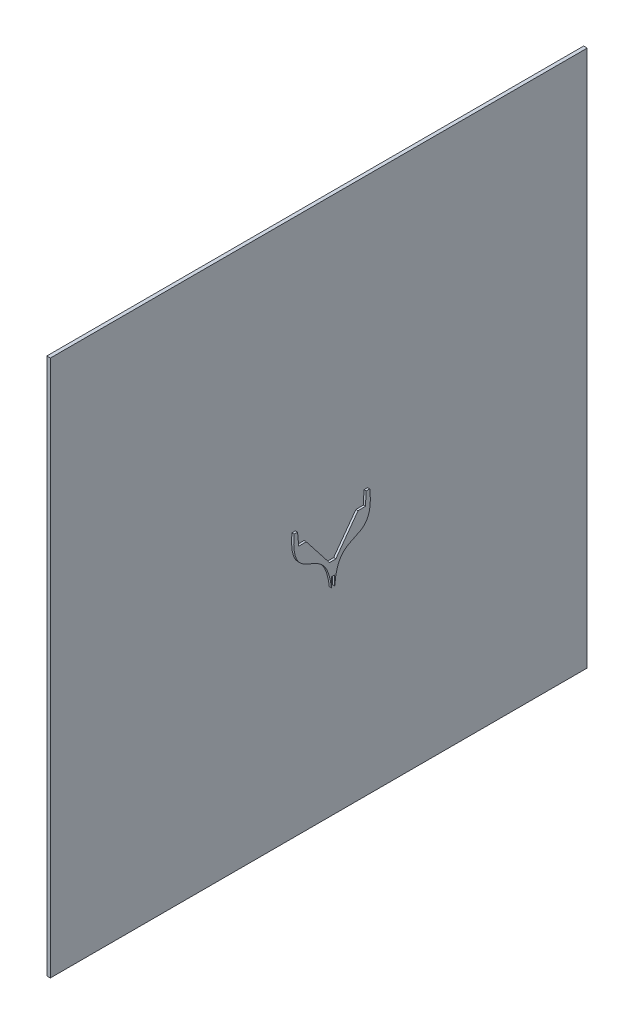
ISO-10303-21;
HEADER;
FILE_DESCRIPTION(('STEP AP214'),'2;1');
FILE_NAME('part.step','',(''),(''),'','','');
FILE_SCHEMA(('AUTOMOTIVE_DESIGN { 1 0 10303 214 1 1 1 1 }'));
ENDSEC;
DATA;
#1=APPLICATION_CONTEXT('core data for automotive mechanical design processes');
#2=APPLICATION_PROTOCOL_DEFINITION('international standard','automotive_design',2000,#1);
#3=PRODUCT_CONTEXT('',#1,'mechanical');
#4=PRODUCT('Part','Part','',(#3));
#5=PRODUCT_RELATED_PRODUCT_CATEGORY('part','',(#4));
#6=PRODUCT_DEFINITION_FORMATION('','',#4);
#7=PRODUCT_DEFINITION_CONTEXT('part definition',#1,'design');
#8=PRODUCT_DEFINITION('design','',#6,#7);
#9=PRODUCT_DEFINITION_SHAPE('','',#8);
#10=(LENGTH_UNIT() NAMED_UNIT(*) SI_UNIT(.MILLI.,.METRE.));
#11=(NAMED_UNIT(*) PLANE_ANGLE_UNIT() SI_UNIT($,.RADIAN.));
#12=(NAMED_UNIT(*) SI_UNIT($,.STERADIAN.) SOLID_ANGLE_UNIT());
#13=UNCERTAINTY_MEASURE_WITH_UNIT(LENGTH_MEASURE(1.E-05),#10,'distance_accuracy_value','');
#14=(GEOMETRIC_REPRESENTATION_CONTEXT(3) GLOBAL_UNCERTAINTY_ASSIGNED_CONTEXT((#13)) GLOBAL_UNIT_ASSIGNED_CONTEXT((#10,
#11,#12)) REPRESENTATION_CONTEXT('',''));
#15=CARTESIAN_POINT('',(0.,0.,0.));
#16=DIRECTION('',(0.,0.,1.));
#17=DIRECTION('',(1.,0.,0.));
#18=AXIS2_PLACEMENT_3D('',#15,#16,#17);
#19=CARTESIAN_POINT('',(6.,370.822129591888,112.598828297359));
#20=CARTESIAN_POINT('',(6.,182.874693997176,126.922352921726));
#21=CARTESIAN_POINT('',(6.,385.564297762641,-42.5084959713896));
#22=CARTESIAN_POINT('',(6.,144.574203419103,18.4897994914163));
#23=CARTESIAN_POINT('',(6.,0.,0.));
#24=B_SPLINE_CURVE_WITH_KNOTS('',4,(#19,#20,#21,#22,#23),.UNSPECIFIED.,.F.,.F.,(5,5),(0.,1.),.UNSPECIFIED.);
#25=DIRECTION('',(-1.,0.,0.));
#26=VECTOR('',#25,1.);
#27=SURFACE_OF_LINEAR_EXTRUSION('',#24,#26);
#28=CARTESIAN_POINT('',(0.,370.822129591888,112.598828297359));
#29=CARTESIAN_POINT('',(0.,182.874693997176,126.922352921726));
#30=CARTESIAN_POINT('',(0.,385.564297762641,-42.5084959713896));
#31=CARTESIAN_POINT('',(0.,144.574203419103,18.4897994914163));
#32=CARTESIAN_POINT('',(0.,0.,0.));
#33=B_SPLINE_CURVE_WITH_KNOTS('',4,(#28,#29,#30,#31,#32),.UNSPECIFIED.,.F.,.F.,(5,5),(0.,1.),.UNSPECIFIED.);
#34=CARTESIAN_POINT('',(0.,370.822129591888,112.598828297359));
#35=VERTEX_POINT('',#34);
#36=CARTESIAN_POINT('',(0.,188.386674921609,7.91417243718743));
#37=VERTEX_POINT('',#36);
#38=EDGE_CURVE('E168',#35,#37,#33,.T.);
#39=ORIENTED_EDGE('',*,*,#38,.T.);
#40=DIRECTION('',(1.,0.,0.));
#41=VECTOR('',#40,1.);
#42=CARTESIAN_POINT('',(0.,188.386674921609,7.91417243718743));
#43=LINE('',#42,#41);
#44=CARTESIAN_POINT('',(6.,188.386674921609,7.91417243718743));
#45=VERTEX_POINT('',#44);
#46=EDGE_CURVE('E174',#37,#45,#43,.T.);
#47=ORIENTED_EDGE('',*,*,#46,.T.);
#48=CARTESIAN_POINT('',(6.,370.822129591888,112.598828297359));
#49=VERTEX_POINT('',#48);
#50=EDGE_CURVE('E201',#49,#45,#24,.T.);
#51=ORIENTED_EDGE('',*,*,#50,.F.);
#52=DIRECTION('',(-1.,0.,0.));
#53=VECTOR('',#52,1.);
#54=CARTESIAN_POINT('',(6.,370.822129591888,112.598828297359));
#55=LINE('',#54,#53);
#56=EDGE_CURVE('E164',#49,#35,#55,.T.);
#57=ORIENTED_EDGE('',*,*,#56,.T.);
#58=EDGE_LOOP('',(#39,#47,#51,#57));
#59=FACE_BOUND('',#58,.T.);
#60=ADVANCED_FACE('F45',(#59),#27,.F.);
#61=CARTESIAN_POINT('',(6.,0.,0.));
#62=CARTESIAN_POINT('',(6.,145.149025233633,-13.2413539046072));
#63=CARTESIAN_POINT('',(6.,383.771712272267,56.4453080296346));
#64=CARTESIAN_POINT('',(6.,187.351690565542,-120.215562295326));
#65=CARTESIAN_POINT('',(6.,374.657028519018,-99.0941921118525));
#66=B_SPLINE_CURVE_WITH_KNOTS('',4,(#61,#62,#63,#64,#65),.UNSPECIFIED.,.F.,.F.,(5,5),(0.,1.),.UNSPECIFIED.);
#67=DIRECTION('',(-1.,0.,0.));
#68=VECTOR('',#67,1.);
#69=SURFACE_OF_LINEAR_EXTRUSION('',#66,#68);
#70=CARTESIAN_POINT('',(6.,188.549713316911,-1.08582756281257));
#71=VERTEX_POINT('',#70);
#72=CARTESIAN_POINT('',(6.,374.657028519018,-99.0941921118525));
#73=VERTEX_POINT('',#72);
#74=EDGE_CURVE('E116',#71,#73,#66,.T.);
#75=ORIENTED_EDGE('',*,*,#74,.F.);
#76=DIRECTION('',(1.,0.,0.));
#77=VECTOR('',#76,1.);
#78=CARTESIAN_POINT('',(0.,188.549713316911,-1.08582756281257));
#79=LINE('',#78,#77);
#80=CARTESIAN_POINT('',(0.,188.549713316911,-1.08582756281257));
#81=VERTEX_POINT('',#80);
#82=EDGE_CURVE('E321',#81,#71,#79,.T.);
#83=ORIENTED_EDGE('',*,*,#82,.F.);
#84=CARTESIAN_POINT('',(0.,0.,0.));
#85=CARTESIAN_POINT('',(0.,145.149025233633,-13.2413539046072));
#86=CARTESIAN_POINT('',(0.,383.771712272267,56.4453080296346));
#87=CARTESIAN_POINT('',(0.,187.351690565542,-120.215562295326));
#88=CARTESIAN_POINT('',(0.,374.657028519018,-99.0941921118525));
#89=B_SPLINE_CURVE_WITH_KNOTS('',4,(#84,#85,#86,#87,#88),.UNSPECIFIED.,.F.,.F.,(5,5),(0.,1.),.UNSPECIFIED.);
#90=CARTESIAN_POINT('',(0.,374.657028519018,-99.0941921118525));
#91=VERTEX_POINT('',#90);
#92=EDGE_CURVE('E173',#81,#91,#89,.T.);
#93=ORIENTED_EDGE('',*,*,#92,.T.);
#94=DIRECTION('',(-1.,0.,0.));
#95=VECTOR('',#94,1.);
#96=CARTESIAN_POINT('',(6.,374.657028519018,-99.0941921118525));
#97=LINE('',#96,#95);
#98=EDGE_CURVE('E13',#73,#91,#97,.T.);
#99=ORIENTED_EDGE('',*,*,#98,.F.);
#100=EDGE_LOOP('',(#75,#83,#93,#99));
#101=FACE_BOUND('',#100,.T.);
#102=ADVANCED_FACE('F261',(#101),#69,.F.);
#103=CARTESIAN_POINT('',(6.,374.657028519018,-99.0941921118525));
#104=DIRECTION('',(0.,-0.999835956927465,-0.0181124055536444));
#105=DIRECTION('',(0.,0.0181124055536444,-0.999835956927465));
#106=AXIS2_PLACEMENT_3D('',#103,#104,#105);
#107=PLANE('',#106);
#108=DIRECTION('',(0.,-0.0181124055536444,0.999835956927465));
#109=VECTOR('',#108,1.);
#110=CARTESIAN_POINT('',(0.,374.657028519018,-99.0941921118525));
#111=LINE('',#110,#109);
#112=CARTESIAN_POINT('',(0.,374.47587474646,-89.0941921118525));
#113=VERTEX_POINT('',#112);
#114=EDGE_CURVE('E181',#91,#113,#111,.T.);
#115=ORIENTED_EDGE('',*,*,#114,.T.);
#116=DIRECTION('',(-1.,0.,0.));
#117=VECTOR('',#116,1.);
#118=CARTESIAN_POINT('',(6.,374.47587474646,-89.0941921118525));
#119=LINE('',#118,#117);
#120=CARTESIAN_POINT('',(6.,374.47587474646,-89.0941921118525));
#121=VERTEX_POINT('',#120);
#122=EDGE_CURVE('E53',#121,#113,#119,.T.);
#123=ORIENTED_EDGE('',*,*,#122,.F.);
#124=DIRECTION('',(0.,-0.0181124055536444,0.999835956927465));
#125=VECTOR('',#124,1.);
#126=CARTESIAN_POINT('',(6.,374.657028519018,-99.0941921118525));
#127=LINE('',#126,#125);
#128=EDGE_CURVE('E249',#73,#121,#127,.T.);
#129=ORIENTED_EDGE('',*,*,#128,.F.);
#130=ORIENTED_EDGE('',*,*,#98,.T.);
#131=EDGE_LOOP('',(#115,#123,#129,#130));
#132=FACE_BOUND('',#131,.T.);
#133=ADVANCED_FACE('F264',(#132),#107,.F.);
#134=CARTESIAN_POINT('',(6.,374.47587474646,-89.0941921118525));
#135=DIRECTION('',(0.,-0.0547192958963739,-0.998501776992212));
#136=DIRECTION('',(0.,0.998501776992212,-0.0547192958963739));
#137=AXIS2_PLACEMENT_3D('',#134,#135,#136);
#138=PLANE('',#137);
#139=DIRECTION('',(0.,-0.998501776992212,0.0547192958963739));
#140=VECTOR('',#139,1.);
#141=CARTESIAN_POINT('',(0.,374.47587474646,-89.0941921118525));
#142=LINE('',#141,#140);
#143=CARTESIAN_POINT('',(0.,338.422661800034,-87.1184255456946));
#144=VERTEX_POINT('',#143);
#145=EDGE_CURVE('E186',#113,#144,#142,.T.);
#146=ORIENTED_EDGE('',*,*,#145,.T.);
#147=DIRECTION('',(-1.,0.,0.));
#148=VECTOR('',#147,1.);
#149=CARTESIAN_POINT('',(6.,338.422661800034,-87.1184255456946));
#150=LINE('',#149,#148);
#151=CARTESIAN_POINT('',(6.,338.422661800034,-87.1184255456946));
#152=VERTEX_POINT('',#151);
#153=EDGE_CURVE('E214',#152,#144,#150,.T.);
#154=ORIENTED_EDGE('',*,*,#153,.F.);
#155=DIRECTION('',(0.,-0.998501776992212,0.0547192958963739));
#156=VECTOR('',#155,1.);
#157=CARTESIAN_POINT('',(6.,374.47587474646,-89.0941921118525));
#158=LINE('',#157,#156);
#159=EDGE_CURVE('E223',#121,#152,#158,.T.);
#160=ORIENTED_EDGE('',*,*,#159,.F.);
#161=ORIENTED_EDGE('',*,*,#122,.T.);
#162=EDGE_LOOP('',(#146,#154,#160,#161));
#163=FACE_BOUND('',#162,.T.);
#164=ADVANCED_FACE('F221',(#163),#138,.F.);
#165=CARTESIAN_POINT('',(6.,338.422661800034,-87.1184255456946));
#166=DIRECTION('',(0.,-0.999835956927465,-0.0181124055536402));
#167=DIRECTION('',(0.,0.0181124055536402,-0.999835956927466));
#168=AXIS2_PLACEMENT_3D('',#165,#166,#167);
#169=PLANE('',#168);
#170=DIRECTION('',(0.,-0.0181124055536402,0.999835956927465));
#171=VECTOR('',#170,1.);
#172=CARTESIAN_POINT('',(0.,338.422661800034,-87.1184255456946));
#173=LINE('',#172,#171);
#174=CARTESIAN_POINT('',(0.,338.04602384503,-66.3273622580532));
#175=VERTEX_POINT('',#174);
#176=EDGE_CURVE('E188',#144,#175,#173,.T.);
#177=ORIENTED_EDGE('',*,*,#176,.T.);
#178=DIRECTION('',(-1.,0.,0.));
#179=VECTOR('',#178,1.);
#180=CARTESIAN_POINT('',(6.,338.04602384503,-66.3273622580532));
#181=LINE('',#180,#179);
#182=CARTESIAN_POINT('',(6.,338.04602384503,-66.3273622580532));
#183=VERTEX_POINT('',#182);
#184=EDGE_CURVE('E211',#183,#175,#181,.T.);
#185=ORIENTED_EDGE('',*,*,#184,.F.);
#186=DIRECTION('',(0.,-0.0181124055536402,0.999835956927465));
#187=VECTOR('',#186,1.);
#188=CARTESIAN_POINT('',(6.,338.422661800034,-87.1184255456946));
#189=LINE('',#188,#187);
#190=EDGE_CURVE('E243',#152,#183,#189,.T.);
#191=ORIENTED_EDGE('',*,*,#190,.F.);
#192=ORIENTED_EDGE('',*,*,#153,.T.);
#193=EDGE_LOOP('',(#177,#185,#191,#192));
#194=FACE_BOUND('',#193,.T.);
#195=ADVANCED_FACE('F234',(#194),#169,.F.);
#196=CARTESIAN_POINT('',(6.,338.04602384503,-66.3273622580532));
#197=DIRECTION('',(0.,-0.588261522683057,-0.808670749397189));
#198=DIRECTION('',(0.,0.808670749397189,-0.588261522683057));
#199=AXIS2_PLACEMENT_3D('',#196,#197,#198);
#200=PLANE('',#199);
#201=DIRECTION('',(0.,-0.808670749397189,0.588261522683057));
#202=VECTOR('',#201,1.);
#203=CARTESIAN_POINT('',(0.,338.04602384503,-66.3273622580532));
#204=LINE('',#203,#202);
#205=CARTESIAN_POINT('',(0.,252.698090033362,-4.24164252683945));
#206=VERTEX_POINT('',#205);
#207=EDGE_CURVE('E190',#175,#206,#204,.T.);
#208=ORIENTED_EDGE('',*,*,#207,.T.);
#209=DIRECTION('',(-1.,0.,0.));
#210=VECTOR('',#209,1.);
#211=CARTESIAN_POINT('',(6.,252.698090033362,-4.24164252683945));
#212=LINE('',#211,#210);
#213=CARTESIAN_POINT('',(6.,252.698090033362,-4.24164252683945));
#214=VERTEX_POINT('',#213);
#215=EDGE_CURVE('E208',#214,#206,#212,.T.);
#216=ORIENTED_EDGE('',*,*,#215,.F.);
#217=DIRECTION('',(0.,-0.808670749397189,0.588261522683057));
#218=VECTOR('',#217,1.);
#219=CARTESIAN_POINT('',(6.,338.04602384503,-66.3273622580532));
#220=LINE('',#219,#218);
#221=EDGE_CURVE('E240',#183,#214,#220,.T.);
#222=ORIENTED_EDGE('',*,*,#221,.F.);
#223=ORIENTED_EDGE('',*,*,#184,.T.);
#224=EDGE_LOOP('',(#208,#216,#222,#223));
#225=FACE_BOUND('',#224,.T.);
#226=ADVANCED_FACE('F238',(#225),#200,.F.);
#227=CARTESIAN_POINT('',(6.,252.378662655529,13.3912984449269));
#228=DIRECTION('',(0.,-0.999835956927465,-0.0181124055536442));
#229=DIRECTION('',(0.,0.0181124055536442,-0.999835956927465));
#230=AXIS2_PLACEMENT_3D('',#227,#228,#229);
#231=PLANE('',#230);
#232=DIRECTION('',(0.,-0.0181124055536442,0.999835956927465));
#233=VECTOR('',#232,1.);
#234=CARTESIAN_POINT('',(0.,252.378662655529,13.3912984449269));
#235=LINE('',#234,#233);
#236=CARTESIAN_POINT('',(0.,252.378662655529,13.3912984449269));
#237=VERTEX_POINT('',#236);
#238=EDGE_CURVE('E193',#206,#237,#235,.T.);
#239=ORIENTED_EDGE('',*,*,#238,.T.);
#240=DIRECTION('',(-1.,0.,0.));
#241=VECTOR('',#240,1.);
#242=CARTESIAN_POINT('',(6.,252.378662655529,13.3912984449269));
#243=LINE('',#242,#241);
#244=CARTESIAN_POINT('',(6.,252.378662655529,13.3912984449269));
#245=VERTEX_POINT('',#244);
#246=EDGE_CURVE('E205',#245,#237,#243,.T.);
#247=ORIENTED_EDGE('',*,*,#246,.F.);
#248=DIRECTION('',(0.,-0.0181124055536442,0.999835956927465));
#249=VECTOR('',#248,1.);
#250=CARTESIAN_POINT('',(6.,252.698090033362,-4.24164252683945));
#251=LINE('',#250,#249);
#252=EDGE_CURVE('E242',#214,#245,#251,.T.);
#253=ORIENTED_EDGE('',*,*,#252,.F.);
#254=ORIENTED_EDGE('',*,*,#215,.T.);
#255=EDGE_LOOP('',(#239,#247,#253,#254));
#256=FACE_BOUND('',#255,.T.);
#257=ADVANCED_FACE('F274',(#256),#231,.F.);
#258=CARTESIAN_POINT('',(6.,335.421923581735,78.5274881953701));
#259=DIRECTION('',(0.,-0.617164693109037,0.786833998744098));
#260=DIRECTION('',(0.,-0.786833998744098,-0.617164693109037));
#261=AXIS2_PLACEMENT_3D('',#258,#259,#260);
#262=PLANE('',#261);
#263=DIRECTION('',(0.,0.786833998744098,0.617164693109037));
#264=VECTOR('',#263,1.);
#265=CARTESIAN_POINT('',(0.,335.421923581735,78.5274881953701));
#266=LINE('',#265,#264);
#267=CARTESIAN_POINT('',(0.,335.421923581735,78.5274881953701));
#268=VERTEX_POINT('',#267);
#269=EDGE_CURVE('E195',#237,#268,#266,.T.);
#270=ORIENTED_EDGE('',*,*,#269,.T.);
#271=DIRECTION('',(-1.,0.,0.));
#272=VECTOR('',#271,1.);
#273=CARTESIAN_POINT('',(6.,335.421923581735,78.5274881953701));
#274=LINE('',#273,#272);
#275=CARTESIAN_POINT('',(6.,335.421923581735,78.5274881953701));
#276=VERTEX_POINT('',#275);
#277=EDGE_CURVE('E159',#276,#268,#274,.T.);
#278=ORIENTED_EDGE('',*,*,#277,.F.);
#279=DIRECTION('',(0.,0.786833998744098,0.617164693109037));
#280=VECTOR('',#279,1.);
#281=CARTESIAN_POINT('',(6.,335.421923581735,78.5274881953701));
#282=LINE('',#281,#280);
#283=EDGE_CURVE('E147',#245,#276,#282,.T.);
#284=ORIENTED_EDGE('',*,*,#283,.F.);
#285=ORIENTED_EDGE('',*,*,#246,.T.);
#286=EDGE_LOOP('',(#270,#278,#284,#285));
#287=FACE_BOUND('',#286,.T.);
#288=ADVANCED_FACE('F277',(#287),#262,.F.);
#289=CARTESIAN_POINT('',(6.,335.04528562673,99.3185514830115));
#290=DIRECTION('',(0.,-0.999835956927465,-0.0181124055536429));
#291=DIRECTION('',(0.,0.0181124055536429,-0.999835956927466));
#292=AXIS2_PLACEMENT_3D('',#289,#290,#291);
#293=PLANE('',#292);
#294=DIRECTION('',(0.,-0.0181124055536429,0.999835956927465));
#295=VECTOR('',#294,1.);
#296=CARTESIAN_POINT('',(0.,335.04528562673,99.3185514830115));
#297=LINE('',#296,#295);
#298=CARTESIAN_POINT('',(0.,335.04528562673,99.3185514830115));
#299=VERTEX_POINT('',#298);
#300=EDGE_CURVE('E156',#268,#299,#297,.T.);
#301=ORIENTED_EDGE('',*,*,#300,.T.);
#302=DIRECTION('',(-1.,0.,0.));
#303=VECTOR('',#302,1.);
#304=CARTESIAN_POINT('',(6.,335.04528562673,99.3185514830115));
#305=LINE('',#304,#303);
#306=CARTESIAN_POINT('',(6.,335.04528562673,99.3185514830115));
#307=VERTEX_POINT('',#306);
#308=EDGE_CURVE('E153',#307,#299,#305,.T.);
#309=ORIENTED_EDGE('',*,*,#308,.F.);
#310=DIRECTION('',(0.,-0.0181124055536429,0.999835956927465));
#311=VECTOR('',#310,1.);
#312=CARTESIAN_POINT('',(6.,335.04528562673,99.3185514830115));
#313=LINE('',#312,#311);
#314=EDGE_CURVE('E139',#276,#307,#313,.T.);
#315=ORIENTED_EDGE('',*,*,#314,.F.);
#316=ORIENTED_EDGE('',*,*,#277,.T.);
#317=EDGE_LOOP('',(#301,#309,#315,#316));
#318=FACE_BOUND('',#317,.T.);
#319=ADVANCED_FACE('F154',(#318),#293,.F.);
#320=CARTESIAN_POINT('',(6.,371.003283364446,102.598828297359));
#321=DIRECTION('',(0.,-0.0908479982912777,0.995864770541898));
#322=DIRECTION('',(0.,-0.995864770541899,-0.0908479982912777));
#323=AXIS2_PLACEMENT_3D('',#320,#321,#322);
#324=PLANE('',#323);
#325=DIRECTION('',(0.,0.995864770541898,0.0908479982912777));
#326=VECTOR('',#325,1.);
#327=CARTESIAN_POINT('',(0.,371.003283364446,102.598828297359));
#328=LINE('',#327,#326);
#329=CARTESIAN_POINT('',(0.,371.003283364446,102.598828297359));
#330=VERTEX_POINT('',#329);
#331=EDGE_CURVE('E198',#299,#330,#328,.T.);
#332=ORIENTED_EDGE('',*,*,#331,.T.);
#333=DIRECTION('',(-1.,0.,0.));
#334=VECTOR('',#333,1.);
#335=CARTESIAN_POINT('',(6.,371.003283364446,102.598828297359));
#336=LINE('',#335,#334);
#337=CARTESIAN_POINT('',(6.,371.003283364446,102.598828297359));
#338=VERTEX_POINT('',#337);
#339=EDGE_CURVE('E160',#338,#330,#336,.T.);
#340=ORIENTED_EDGE('',*,*,#339,.F.);
#341=DIRECTION('',(0.,0.995864770541898,0.0908479982912777));
#342=VECTOR('',#341,1.);
#343=CARTESIAN_POINT('',(6.,371.003283364446,102.598828297359));
#344=LINE('',#343,#342);
#345=EDGE_CURVE('E144',#307,#338,#344,.T.);
#346=ORIENTED_EDGE('',*,*,#345,.F.);
#347=ORIENTED_EDGE('',*,*,#308,.T.);
#348=EDGE_LOOP('',(#332,#340,#346,#347));
#349=FACE_BOUND('',#348,.T.);
#350=ADVANCED_FACE('F162',(#349),#324,.F.);
#351=CARTESIAN_POINT('',(6.,370.822129591888,112.598828297359));
#352=DIRECTION('',(0.,-0.999835956927465,-0.0181124055536442));
#353=DIRECTION('',(0.,0.0181124055536442,-0.999835956927465));
#354=AXIS2_PLACEMENT_3D('',#351,#352,#353);
#355=PLANE('',#354);
#356=DIRECTION('',(0.,-0.0181124055536442,0.999835956927465));
#357=VECTOR('',#356,1.);
#358=CARTESIAN_POINT('',(0.,370.822129591888,112.598828297359));
#359=LINE('',#358,#357);
#360=EDGE_CURVE('E108',#330,#35,#359,.T.);
#361=ORIENTED_EDGE('',*,*,#360,.T.);
#362=ORIENTED_EDGE('',*,*,#56,.F.);
#363=DIRECTION('',(0.,-0.0181124055536442,0.999835956927465));
#364=VECTOR('',#363,1.);
#365=CARTESIAN_POINT('',(6.,370.822129591888,112.598828297359));
#366=LINE('',#365,#364);
#367=EDGE_CURVE('E69',#338,#49,#366,.T.);
#368=ORIENTED_EDGE('',*,*,#367,.F.);
#369=ORIENTED_EDGE('',*,*,#339,.T.);
#370=EDGE_LOOP('',(#361,#362,#368,#369));
#371=FACE_BOUND('',#370,.T.);
#372=ADVANCED_FACE('F286',(#371),#355,.F.);
#373=CARTESIAN_POINT('',(6.,249.625219114553,27.4497788825994));
#374=DIRECTION('',(1.,0.,0.));
#375=DIRECTION('',(0.,0.,-1.));
#376=AXIS2_PLACEMENT_3D('',#373,#374,#375);
#377=PLANE('',#376);
#378=DIRECTION('',(0.,-0.999835956927465,-0.018112405553643));
#379=VECTOR('',#378,1.);
#380=CARTESIAN_POINT('',(6.,188.386674921609,7.91417243718743));
#381=LINE('',#380,#379);
#382=CARTESIAN_POINT('',(6.,215.386674921609,8.40328762309371));
#383=VERTEX_POINT('',#382);
#384=EDGE_CURVE('E335',#383,#45,#381,.T.);
#385=ORIENTED_EDGE('',*,*,#384,.F.);
#386=DIRECTION('',(0.,-0.0181124055536438,0.999835956927465));
#387=VECTOR('',#386,1.);
#388=CARTESIAN_POINT('',(6.,215.386674921609,8.40328762309371));
#389=LINE('',#388,#387);
#390=CARTESIAN_POINT('',(6.,215.549713316911,-0.596712376906292));
#391=VERTEX_POINT('',#390);
#392=EDGE_CURVE('E332',#391,#383,#389,.T.);
#393=ORIENTED_EDGE('',*,*,#392,.F.);
#394=DIRECTION('',(0.,0.999835956927465,0.0181124055536428));
#395=VECTOR('',#394,1.);
#396=CARTESIAN_POINT('',(6.,215.549713316911,-0.596712376906292));
#397=LINE('',#396,#395);
#398=EDGE_CURVE('E329',#71,#391,#397,.T.);
#399=ORIENTED_EDGE('',*,*,#398,.F.);
#400=ORIENTED_EDGE('',*,*,#74,.T.);
#401=ORIENTED_EDGE('',*,*,#128,.T.);
#402=ORIENTED_EDGE('',*,*,#159,.T.);
#403=ORIENTED_EDGE('',*,*,#190,.T.);
#404=ORIENTED_EDGE('',*,*,#221,.T.);
#405=ORIENTED_EDGE('',*,*,#252,.T.);
#406=ORIENTED_EDGE('',*,*,#283,.T.);
#407=ORIENTED_EDGE('',*,*,#314,.T.);
#408=ORIENTED_EDGE('',*,*,#345,.T.);
#409=ORIENTED_EDGE('',*,*,#367,.T.);
#410=ORIENTED_EDGE('',*,*,#50,.T.);
#411=EDGE_LOOP('',(#385,#393,#399,#400,#401,#402,#403,#404,#405,#406,#407,#408,#409,#410));
#412=FACE_BOUND('',#411,.T.);
#413=ADVANCED_FACE('F142',(#412),#377,.T.);
#414=CARTESIAN_POINT('',(0.,249.625219114553,27.4497788825994));
#415=DIRECTION('',(1.,0.,0.));
#416=DIRECTION('',(0.,0.,-1.));
#417=AXIS2_PLACEMENT_3D('',#414,#415,#416);
#418=PLANE('',#417);
#419=DIRECTION('',(0.,-0.0181124055536438,0.999835956927465));
#420=VECTOR('',#419,1.);
#421=CARTESIAN_POINT('',(0.,215.386674921609,8.40328762309371));
#422=LINE('',#421,#420);
#423=CARTESIAN_POINT('',(0.,215.549713316911,-0.59671237690629));
#424=VERTEX_POINT('',#423);
#425=CARTESIAN_POINT('',(0.,215.386674921609,8.40328762309371));
#426=VERTEX_POINT('',#425);
#427=EDGE_CURVE('E60',#424,#426,#422,.T.);
#428=ORIENTED_EDGE('',*,*,#427,.T.);
#429=DIRECTION('',(0.,-0.999835956927465,-0.018112405553643));
#430=VECTOR('',#429,1.);
#431=CARTESIAN_POINT('',(0.,188.386674921609,7.91417243718743));
#432=LINE('',#431,#430);
#433=EDGE_CURVE('E318',#426,#37,#432,.T.);
#434=ORIENTED_EDGE('',*,*,#433,.T.);
#435=ORIENTED_EDGE('',*,*,#38,.F.);
#436=ORIENTED_EDGE('',*,*,#360,.F.);
#437=ORIENTED_EDGE('',*,*,#331,.F.);
#438=ORIENTED_EDGE('',*,*,#300,.F.);
#439=ORIENTED_EDGE('',*,*,#269,.F.);
#440=ORIENTED_EDGE('',*,*,#238,.F.);
#441=ORIENTED_EDGE('',*,*,#207,.F.);
#442=ORIENTED_EDGE('',*,*,#176,.F.);
#443=ORIENTED_EDGE('',*,*,#145,.F.);
#444=ORIENTED_EDGE('',*,*,#114,.F.);
#445=ORIENTED_EDGE('',*,*,#92,.F.);
#446=DIRECTION('',(0.,0.999835956927465,0.0181124055536428));
#447=VECTOR('',#446,1.);
#448=CARTESIAN_POINT('',(0.,215.549713316911,-0.596712376906292));
#449=LINE('',#448,#447);
#450=EDGE_CURVE('E325',#81,#424,#449,.T.);
#451=ORIENTED_EDGE('',*,*,#450,.T.);
#452=EDGE_LOOP('',(#428,#434,#435,#436,#437,#438,#439,#440,#441,#442,#443,#444,#445,#451));
#453=FACE_BOUND('',#452,.T.);
#454=ADVANCED_FACE('F229',(#453),#418,.F.);
#455=CARTESIAN_POINT('',(0.,188.386674921609,7.91417243718743));
#456=DIRECTION('',(0.,-0.018112405553643,0.999835956927465));
#457=DIRECTION('',(0.,-0.999835956927466,-0.018112405553643));
#458=AXIS2_PLACEMENT_3D('',#455,#456,#457);
#459=PLANE('',#458);
#460=ORIENTED_EDGE('',*,*,#384,.T.);
#461=ORIENTED_EDGE('',*,*,#46,.F.);
#462=ORIENTED_EDGE('',*,*,#433,.F.);
#463=DIRECTION('',(1.,0.,0.));
#464=VECTOR('',#463,1.);
#465=CARTESIAN_POINT('',(0.,215.386674921609,8.40328762309371));
#466=LINE('',#465,#464);
#467=EDGE_CURVE('E338',#426,#383,#466,.T.);
#468=ORIENTED_EDGE('',*,*,#467,.T.);
#469=EDGE_LOOP('',(#460,#461,#462,#468));
#470=FACE_BOUND('',#469,.T.);
#471=ADVANCED_FACE('F291',(#470),#459,.F.);
#472=CARTESIAN_POINT('',(0.,215.386674921609,8.40328762309371));
#473=DIRECTION('',(0.,0.999835956927465,0.0181124055536438));
#474=DIRECTION('',(0.,-0.0181124055536438,0.999835956927466));
#475=AXIS2_PLACEMENT_3D('',#472,#473,#474);
#476=PLANE('',#475);
#477=ORIENTED_EDGE('',*,*,#392,.T.);
#478=ORIENTED_EDGE('',*,*,#467,.F.);
#479=ORIENTED_EDGE('',*,*,#427,.F.);
#480=DIRECTION('',(1.,0.,0.));
#481=VECTOR('',#480,1.);
#482=CARTESIAN_POINT('',(0.,215.549713316911,-0.596712376906292));
#483=LINE('',#482,#481);
#484=EDGE_CURVE('E324',#424,#391,#483,.T.);
#485=ORIENTED_EDGE('',*,*,#484,.T.);
#486=EDGE_LOOP('',(#477,#478,#479,#485));
#487=FACE_BOUND('',#486,.T.);
#488=ADVANCED_FACE('F297',(#487),#476,.F.);
#489=CARTESIAN_POINT('',(0.,215.549713316911,-0.596712376906292));
#490=DIRECTION('',(0.,0.0181124055536428,-0.999835956927465));
#491=DIRECTION('',(0.,0.999835956927466,0.0181124055536428));
#492=AXIS2_PLACEMENT_3D('',#489,#490,#491);
#493=PLANE('',#492);
#494=ORIENTED_EDGE('',*,*,#398,.T.);
#495=ORIENTED_EDGE('',*,*,#484,.F.);
#496=ORIENTED_EDGE('',*,*,#450,.F.);
#497=ORIENTED_EDGE('',*,*,#82,.T.);
#498=EDGE_LOOP('',(#494,#495,#496,#497));
#499=FACE_BOUND('',#498,.T.);
#500=ADVANCED_FACE('F294',(#499),#493,.F.);
#501=CLOSED_SHELL('',(#60,#102,#133,#164,#195,#226,#257,#288,#319,#350,#372,#413,#454,#471,#488,#500));
#502=MANIFOLD_SOLID_BREP('B2',#501);
#503=CARTESIAN_POINT('',(-10.,0.,0.));
#504=DIRECTION('',(-1.,0.,0.));
#505=DIRECTION('',(0.,0.,1.));
#506=AXIS2_PLACEMENT_3D('',#503,#504,#505);
#507=PLANE('',#506);
#508=DIRECTION('',(0.,0.,-1.));
#509=VECTOR('',#508,1.);
#510=CARTESIAN_POINT('',(-10.,-378.710653275796,777.274991403029));
#511=LINE('',#510,#509);
#512=CARTESIAN_POINT('',(-10.,-378.710653275796,777.274991403029));
#513=VERTEX_POINT('',#512);
#514=CARTESIAN_POINT('',(-10.,-378.710653275796,-722.725008596971));
#515=VERTEX_POINT('',#514);
#516=EDGE_CURVE('E465',#513,#515,#511,.T.);
#517=ORIENTED_EDGE('',*,*,#516,.T.);
#518=DIRECTION('',(0.,-1.,0.));
#519=VECTOR('',#518,1.);
#520=CARTESIAN_POINT('',(-10.,1121.2893467242,-722.725008596971));
#521=LINE('',#520,#519);
#522=CARTESIAN_POINT('',(-10.,1121.2893467242,-722.725008596971));
#523=VERTEX_POINT('',#522);
#524=EDGE_CURVE('E499',#523,#515,#521,.T.);
#525=ORIENTED_EDGE('',*,*,#524,.F.);
#526=DIRECTION('',(0.,0.,-1.));
#527=VECTOR('',#526,1.);
#528=CARTESIAN_POINT('',(-10.,1121.2893467242,777.274991403029));
#529=LINE('',#528,#527);
#530=CARTESIAN_POINT('',(-10.,1121.2893467242,777.274991403029));
#531=VERTEX_POINT('',#530);
#532=EDGE_CURVE('E496',#531,#523,#529,.T.);
#533=ORIENTED_EDGE('',*,*,#532,.F.);
#534=DIRECTION('',(0.,-1.,0.));
#535=VECTOR('',#534,1.);
#536=CARTESIAN_POINT('',(-10.,1121.2893467242,777.274991403029));
#537=LINE('',#536,#535);
#538=EDGE_CURVE('E493',#531,#513,#537,.T.);
#539=ORIENTED_EDGE('',*,*,#538,.T.);
#540=EDGE_LOOP('',(#517,#525,#533,#539));
#541=FACE_BOUND('',#540,.T.);
#542=ADVANCED_FACE('F456',(#541),#507,.F.);
#543=CARTESIAN_POINT('',(-20.,0.,0.));
#544=DIRECTION('',(-1.,0.,0.));
#545=DIRECTION('',(0.,0.,1.));
#546=AXIS2_PLACEMENT_3D('',#543,#544,#545);
#547=PLANE('',#546);
#548=DIRECTION('',(0.,0.,-1.));
#549=VECTOR('',#548,1.);
#550=CARTESIAN_POINT('',(-20.,-378.710653275796,777.274991403029));
#551=LINE('',#550,#549);
#552=CARTESIAN_POINT('',(-20.,-378.710653275796,777.274991403029));
#553=VERTEX_POINT('',#552);
#554=CARTESIAN_POINT('',(-20.,-378.710653275796,-722.725008596971));
#555=VERTEX_POINT('',#554);
#556=EDGE_CURVE('E43',#553,#555,#551,.T.);
#557=ORIENTED_EDGE('',*,*,#556,.F.);
#558=DIRECTION('',(0.,-1.,0.));
#559=VECTOR('',#558,1.);
#560=CARTESIAN_POINT('',(-20.,1121.2893467242,777.274991403029));
#561=LINE('',#560,#559);
#562=CARTESIAN_POINT('',(-20.,1121.2893467242,777.274991403029));
#563=VERTEX_POINT('',#562);
#564=EDGE_CURVE('E512',#563,#553,#561,.T.);
#565=ORIENTED_EDGE('',*,*,#564,.F.);
#566=DIRECTION('',(0.,0.,-1.));
#567=VECTOR('',#566,1.);
#568=CARTESIAN_POINT('',(-20.,1121.2893467242,777.274991403029));
#569=LINE('',#568,#567);
#570=CARTESIAN_POINT('',(-20.,1121.2893467242,-722.725008596971));
#571=VERTEX_POINT('',#570);
#572=EDGE_CURVE('E503',#563,#571,#569,.T.);
#573=ORIENTED_EDGE('',*,*,#572,.T.);
#574=DIRECTION('',(0.,-1.,0.));
#575=VECTOR('',#574,1.);
#576=CARTESIAN_POINT('',(-20.,1121.2893467242,-722.725008596971));
#577=LINE('',#576,#575);
#578=EDGE_CURVE('E474',#571,#555,#577,.T.);
#579=ORIENTED_EDGE('',*,*,#578,.T.);
#580=EDGE_LOOP('',(#557,#565,#573,#579));
#581=FACE_BOUND('',#580,.T.);
#582=ADVANCED_FACE('F552',(#581),#547,.T.);
#583=CARTESIAN_POINT('',(-20.,1121.2893467242,777.274991403029));
#584=DIRECTION('',(0.,0.,1.));
#585=DIRECTION('',(1.,0.,0.));
#586=AXIS2_PLACEMENT_3D('',#583,#584,#585);
#587=PLANE('',#586);
#588=ORIENTED_EDGE('',*,*,#538,.F.);
#589=DIRECTION('',(1.,0.,0.));
#590=VECTOR('',#589,1.);
#591=CARTESIAN_POINT('',(-20.,1121.2893467242,777.274991403029));
#592=LINE('',#591,#590);
#593=EDGE_CURVE('E508',#563,#531,#592,.T.);
#594=ORIENTED_EDGE('',*,*,#593,.F.);
#595=ORIENTED_EDGE('',*,*,#564,.T.);
#596=DIRECTION('',(1.,0.,0.));
#597=VECTOR('',#596,1.);
#598=CARTESIAN_POINT('',(-20.,-378.710653275796,777.274991403029));
#599=LINE('',#598,#597);
#600=EDGE_CURVE('E504',#553,#513,#599,.T.);
#601=ORIENTED_EDGE('',*,*,#600,.T.);
#602=EDGE_LOOP('',(#588,#594,#595,#601));
#603=FACE_BOUND('',#602,.T.);
#604=ADVANCED_FACE('F513',(#603),#587,.T.);
#605=CARTESIAN_POINT('',(-20.,-378.710653275796,777.274991403029));
#606=DIRECTION('',(0.,-1.,0.));
#607=DIRECTION('',(0.,0.,-1.));
#608=AXIS2_PLACEMENT_3D('',#605,#606,#607);
#609=PLANE('',#608);
#610=ORIENTED_EDGE('',*,*,#516,.F.);
#611=ORIENTED_EDGE('',*,*,#600,.F.);
#612=ORIENTED_EDGE('',*,*,#556,.T.);
#613=DIRECTION('',(1.,0.,0.));
#614=VECTOR('',#613,1.);
#615=CARTESIAN_POINT('',(-20.,-378.710653275796,-722.725008596971));
#616=LINE('',#615,#614);
#617=EDGE_CURVE('E524',#555,#515,#616,.T.);
#618=ORIENTED_EDGE('',*,*,#617,.T.);
#619=EDGE_LOOP('',(#610,#611,#612,#618));
#620=FACE_BOUND('',#619,.T.);
#621=ADVANCED_FACE('F554',(#620),#609,.T.);
#622=CARTESIAN_POINT('',(-20.,1121.2893467242,777.274991403029));
#623=DIRECTION('',(0.,-1.,0.));
#624=DIRECTION('',(0.,0.,-1.));
#625=AXIS2_PLACEMENT_3D('',#622,#623,#624);
#626=PLANE('',#625);
#627=ORIENTED_EDGE('',*,*,#532,.T.);
#628=DIRECTION('',(1.,0.,0.));
#629=VECTOR('',#628,1.);
#630=CARTESIAN_POINT('',(-20.,1121.2893467242,-722.725008596971));
#631=LINE('',#630,#629);
#632=EDGE_CURVE('E528',#571,#523,#631,.T.);
#633=ORIENTED_EDGE('',*,*,#632,.F.);
#634=ORIENTED_EDGE('',*,*,#572,.F.);
#635=ORIENTED_EDGE('',*,*,#593,.T.);
#636=EDGE_LOOP('',(#627,#633,#634,#635));
#637=FACE_BOUND('',#636,.T.);
#638=ADVANCED_FACE('F509',(#637),#626,.F.);
#639=CARTESIAN_POINT('',(-20.,1121.2893467242,-722.725008596971));
#640=DIRECTION('',(0.,0.,1.));
#641=DIRECTION('',(1.,0.,0.));
#642=AXIS2_PLACEMENT_3D('',#639,#640,#641);
#643=PLANE('',#642);
#644=ORIENTED_EDGE('',*,*,#524,.T.);
#645=ORIENTED_EDGE('',*,*,#617,.F.);
#646=ORIENTED_EDGE('',*,*,#578,.F.);
#647=ORIENTED_EDGE('',*,*,#632,.T.);
#648=EDGE_LOOP('',(#644,#645,#646,#647));
#649=FACE_BOUND('',#648,.T.);
#650=ADVANCED_FACE('F539',(#649),#643,.F.);
#651=CLOSED_SHELL('',(#542,#582,#604,#621,#638,#650));
#652=MANIFOLD_SOLID_BREP('B7_NOT_SHOWN',#651);
#653=ADVANCED_BREP_SHAPE_REPRESENTATION('',(#18,#502,#652),#14);
#654=SHAPE_DEFINITION_REPRESENTATION(#9,#653);
ENDSEC;
END-ISO-10303-21;
